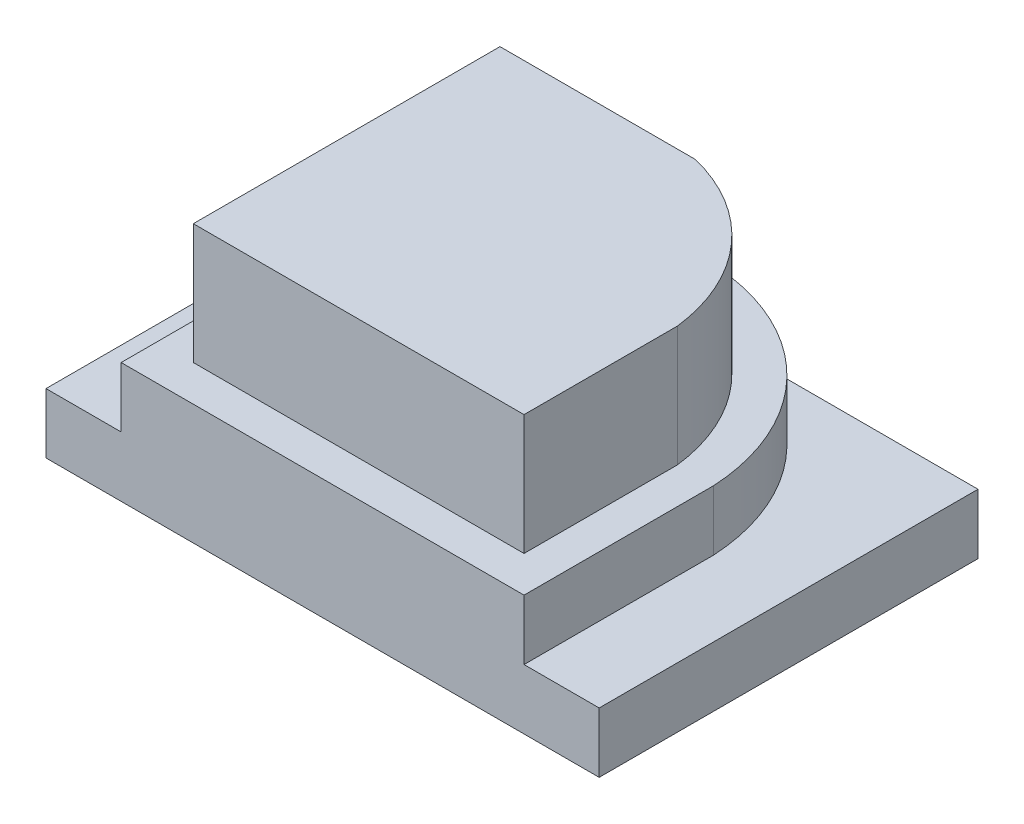
ISO-10303-21;
HEADER;
FILE_DESCRIPTION(('STEP AP214'),'2;1');
FILE_NAME('part.step','',(''),(''),'','','');
FILE_SCHEMA(('AUTOMOTIVE_DESIGN { 1 0 10303 214 1 1 1 1 }'));
ENDSEC;
DATA;
#1=APPLICATION_CONTEXT('core data for automotive mechanical design processes');
#2=APPLICATION_PROTOCOL_DEFINITION('international standard','automotive_design',2000,#1);
#3=PRODUCT_CONTEXT('',#1,'mechanical');
#4=PRODUCT('Part','Part','',(#3));
#5=PRODUCT_RELATED_PRODUCT_CATEGORY('part','',(#4));
#6=PRODUCT_DEFINITION_FORMATION('','',#4);
#7=PRODUCT_DEFINITION_CONTEXT('part definition',#1,'design');
#8=PRODUCT_DEFINITION('design','',#6,#7);
#9=PRODUCT_DEFINITION_SHAPE('','',#8);
#10=(LENGTH_UNIT() NAMED_UNIT(*) SI_UNIT(.MILLI.,.METRE.));
#11=(NAMED_UNIT(*) PLANE_ANGLE_UNIT() SI_UNIT($,.RADIAN.));
#12=(NAMED_UNIT(*) SI_UNIT($,.STERADIAN.) SOLID_ANGLE_UNIT());
#13=UNCERTAINTY_MEASURE_WITH_UNIT(LENGTH_MEASURE(1.E-05),#10,'distance_accuracy_value','');
#14=(GEOMETRIC_REPRESENTATION_CONTEXT(3) GLOBAL_UNCERTAINTY_ASSIGNED_CONTEXT((#13)) GLOBAL_UNIT_ASSIGNED_CONTEXT((#10,
#11,#12)) REPRESENTATION_CONTEXT('',''));
#15=CARTESIAN_POINT('',(0.,0.,0.));
#16=DIRECTION('',(0.,0.,1.));
#17=DIRECTION('',(1.,0.,0.));
#18=AXIS2_PLACEMENT_3D('',#15,#16,#17);
#19=CARTESIAN_POINT('',(-3.21955742457103,2.,-2.44744933126085));
#20=DIRECTION('',(0.,-1.,0.));
#21=DIRECTION('',(0.,0.,-1.));
#22=AXIS2_PLACEMENT_3D('',#19,#20,#21);
#23=CYLINDRICAL_SURFACE('',#22,2.99041189);
#24=CARTESIAN_POINT('',(-3.21955742457103,0.,-2.44744933126085));
#25=DIRECTION('',(0.,1.,0.));
#26=DIRECTION('',(0.,0.,1.));
#27=AXIS2_PLACEMENT_3D('',#24,#25,#26);
#28=CIRCLE('',#27,2.99041189);
#29=CARTESIAN_POINT('',(-2.5,0.,-5.35));
#30=VERTEX_POINT('',#29);
#31=CARTESIAN_POINT('',(-0.25,0.,-2.8));
#32=VERTEX_POINT('',#31);
#33=EDGE_CURVE('E117',#30,#32,#28,.F.);
#34=ORIENTED_EDGE('',*,*,#33,.F.);
#35=DIRECTION('',(0.,-1.,0.));
#36=VECTOR('',#35,1.);
#37=CARTESIAN_POINT('',(-2.5,2.,-5.35));
#38=LINE('',#37,#36);
#39=CARTESIAN_POINT('',(-2.5,2.,-5.35));
#40=VERTEX_POINT('',#39);
#41=EDGE_CURVE('E11',#40,#30,#38,.T.);
#42=ORIENTED_EDGE('',*,*,#41,.F.);
#43=CARTESIAN_POINT('',(-3.21955742457103,2.,-2.44744933126085));
#44=DIRECTION('',(0.,1.,0.));
#45=DIRECTION('',(0.,0.,1.));
#46=AXIS2_PLACEMENT_3D('',#43,#44,#45);
#47=CIRCLE('',#46,2.99041189);
#48=CARTESIAN_POINT('',(-0.25,2.,-2.8));
#49=VERTEX_POINT('',#48);
#50=EDGE_CURVE('E133',#40,#49,#47,.F.);
#51=ORIENTED_EDGE('',*,*,#50,.T.);
#52=DIRECTION('',(0.,-1.,0.));
#53=VECTOR('',#52,1.);
#54=CARTESIAN_POINT('',(-0.25,2.,-2.8));
#55=LINE('',#54,#53);
#56=EDGE_CURVE('E81',#49,#32,#55,.T.);
#57=ORIENTED_EDGE('',*,*,#56,.T.);
#58=EDGE_LOOP('',(#34,#42,#51,#57));
#59=FACE_BOUND('',#58,.T.);
#60=ADVANCED_FACE('F39',(#59),#23,.T.);
#61=CARTESIAN_POINT('',(0.,2.,-5.35));
#62=DIRECTION('',(0.,0.,-1.));
#63=DIRECTION('',(-1.,0.,0.));
#64=AXIS2_PLACEMENT_3D('',#61,#62,#63);
#65=PLANE('',#64);
#66=DIRECTION('',(1.,0.,0.));
#67=VECTOR('',#66,1.);
#68=CARTESIAN_POINT('',(0.,0.,-5.35));
#69=LINE('',#68,#67);
#70=CARTESIAN_POINT('',(-5.75,0.,-5.35));
#71=VERTEX_POINT('',#70);
#72=EDGE_CURVE('E121',#71,#30,#69,.T.);
#73=ORIENTED_EDGE('',*,*,#72,.F.);
#74=DIRECTION('',(0.,-1.,0.));
#75=VECTOR('',#74,1.);
#76=CARTESIAN_POINT('',(-5.75,2.,-5.35));
#77=LINE('',#76,#75);
#78=CARTESIAN_POINT('',(-5.75,2.,-5.35));
#79=VERTEX_POINT('',#78);
#80=EDGE_CURVE('E48',#79,#71,#77,.T.);
#81=ORIENTED_EDGE('',*,*,#80,.F.);
#82=DIRECTION('',(1.,0.,0.));
#83=VECTOR('',#82,1.);
#84=CARTESIAN_POINT('',(0.,2.,-5.35));
#85=LINE('',#84,#83);
#86=EDGE_CURVE('E99',#79,#40,#85,.T.);
#87=ORIENTED_EDGE('',*,*,#86,.T.);
#88=ORIENTED_EDGE('',*,*,#41,.T.);
#89=EDGE_LOOP('',(#73,#81,#87,#88));
#90=FACE_BOUND('',#89,.T.);
#91=ADVANCED_FACE('F140',(#90),#65,.T.);
#92=CARTESIAN_POINT('',(-5.75,2.,0.));
#93=DIRECTION('',(1.,0.,0.));
#94=DIRECTION('',(0.,0.,-1.));
#95=AXIS2_PLACEMENT_3D('',#92,#93,#94);
#96=PLANE('',#95);
#97=DIRECTION('',(0.,0.,1.));
#98=VECTOR('',#97,1.);
#99=CARTESIAN_POINT('',(-5.75,0.,0.));
#100=LINE('',#99,#98);
#101=CARTESIAN_POINT('',(-5.75,0.,-0.249999999999999));
#102=VERTEX_POINT('',#101);
#103=EDGE_CURVE('E106',#71,#102,#100,.T.);
#104=ORIENTED_EDGE('',*,*,#103,.T.);
#105=DIRECTION('',(0.,-1.,0.));
#106=VECTOR('',#105,1.);
#107=CARTESIAN_POINT('',(-5.75,2.,-0.249999999999999));
#108=LINE('',#107,#106);
#109=CARTESIAN_POINT('',(-5.75,2.,-0.249999999999999));
#110=VERTEX_POINT('',#109);
#111=EDGE_CURVE('E103',#110,#102,#108,.T.);
#112=ORIENTED_EDGE('',*,*,#111,.F.);
#113=DIRECTION('',(0.,0.,1.));
#114=VECTOR('',#113,1.);
#115=CARTESIAN_POINT('',(-5.75,2.,0.));
#116=LINE('',#115,#114);
#117=EDGE_CURVE('E93',#79,#110,#116,.T.);
#118=ORIENTED_EDGE('',*,*,#117,.F.);
#119=ORIENTED_EDGE('',*,*,#80,.T.);
#120=EDGE_LOOP('',(#104,#112,#118,#119));
#121=FACE_BOUND('',#120,.T.);
#122=ADVANCED_FACE('F104',(#121),#96,.F.);
#123=CARTESIAN_POINT('',(0.,2.,-0.249999999999999));
#124=DIRECTION('',(0.,0.,-1.));
#125=DIRECTION('',(-1.,0.,0.));
#126=AXIS2_PLACEMENT_3D('',#123,#124,#125);
#127=PLANE('',#126);
#128=DIRECTION('',(1.,0.,0.));
#129=VECTOR('',#128,1.);
#130=CARTESIAN_POINT('',(0.,0.,-0.249999999999999));
#131=LINE('',#130,#129);
#132=CARTESIAN_POINT('',(-0.25,0.,-0.249999999999999));
#133=VERTEX_POINT('',#132);
#134=EDGE_CURVE('E74',#102,#133,#131,.T.);
#135=ORIENTED_EDGE('',*,*,#134,.T.);
#136=DIRECTION('',(0.,-1.,0.));
#137=VECTOR('',#136,1.);
#138=CARTESIAN_POINT('',(-0.25,2.,-0.249999999999999));
#139=LINE('',#138,#137);
#140=CARTESIAN_POINT('',(-0.25,2.,-0.249999999999999));
#141=VERTEX_POINT('',#140);
#142=EDGE_CURVE('E108',#141,#133,#139,.T.);
#143=ORIENTED_EDGE('',*,*,#142,.F.);
#144=DIRECTION('',(1.,0.,0.));
#145=VECTOR('',#144,1.);
#146=CARTESIAN_POINT('',(0.,2.,-0.249999999999999));
#147=LINE('',#146,#145);
#148=EDGE_CURVE('E97',#110,#141,#147,.T.);
#149=ORIENTED_EDGE('',*,*,#148,.F.);
#150=ORIENTED_EDGE('',*,*,#111,.T.);
#151=EDGE_LOOP('',(#135,#143,#149,#150));
#152=FACE_BOUND('',#151,.T.);
#153=ADVANCED_FACE('F110',(#152),#127,.F.);
#154=CARTESIAN_POINT('',(-0.25,2.,0.));
#155=DIRECTION('',(-1.,0.,0.));
#156=DIRECTION('',(0.,0.,1.));
#157=AXIS2_PLACEMENT_3D('',#154,#155,#156);
#158=PLANE('',#157);
#159=DIRECTION('',(0.,0.,-1.));
#160=VECTOR('',#159,1.);
#161=CARTESIAN_POINT('',(-0.25,0.,0.));
#162=LINE('',#161,#160);
#163=EDGE_CURVE('E130',#133,#32,#162,.T.);
#164=ORIENTED_EDGE('',*,*,#163,.T.);
#165=ORIENTED_EDGE('',*,*,#56,.F.);
#166=DIRECTION('',(0.,0.,-1.));
#167=VECTOR('',#166,1.);
#168=CARTESIAN_POINT('',(-0.25,2.,0.));
#169=LINE('',#168,#167);
#170=EDGE_CURVE('E56',#141,#49,#169,.T.);
#171=ORIENTED_EDGE('',*,*,#170,.F.);
#172=ORIENTED_EDGE('',*,*,#142,.T.);
#173=EDGE_LOOP('',(#164,#165,#171,#172));
#174=FACE_BOUND('',#173,.T.);
#175=ADVANCED_FACE('F145',(#174),#158,.F.);
#176=CARTESIAN_POINT('',(0.,2.,0.));
#177=DIRECTION('',(0.,1.,0.));
#178=DIRECTION('',(0.,0.,1.));
#179=AXIS2_PLACEMENT_3D('',#176,#177,#178);
#180=PLANE('',#179);
#181=ORIENTED_EDGE('',*,*,#50,.F.);
#182=ORIENTED_EDGE('',*,*,#86,.F.);
#183=ORIENTED_EDGE('',*,*,#117,.T.);
#184=ORIENTED_EDGE('',*,*,#148,.T.);
#185=ORIENTED_EDGE('',*,*,#170,.T.);
#186=EDGE_LOOP('',(#181,#182,#183,#184,#185));
#187=FACE_BOUND('',#186,.T.);
#188=ADVANCED_FACE('F95',(#187),#180,.T.);
#189=CARTESIAN_POINT('',(-3.00990920916928,0.,-2.62436785837065));
#190=DIRECTION('',(0.,-1.,0.));
#191=DIRECTION('',(0.,0.,-1.));
#192=AXIS2_PLACEMENT_3D('',#189,#190,#191);
#193=PLANE('',#192);
#194=DIRECTION('',(0.,0.,-1.));
#195=VECTOR('',#194,1.);
#196=CARTESIAN_POINT('',(-6.35,0.,0.35));
#197=LINE('',#196,#195);
#198=CARTESIAN_POINT('',(-6.35,0.,0.35));
#199=VERTEX_POINT('',#198);
#200=CARTESIAN_POINT('',(-6.35,0.,-5.95));
#201=VERTEX_POINT('',#200);
#202=EDGE_CURVE('E187',#199,#201,#197,.T.);
#203=ORIENTED_EDGE('',*,*,#202,.F.);
#204=DIRECTION('',(-1.,0.,0.));
#205=VECTOR('',#204,1.);
#206=CARTESIAN_POINT('',(-6.35,0.,0.35));
#207=LINE('',#206,#205);
#208=CARTESIAN_POINT('',(0.35,0.,0.35));
#209=VERTEX_POINT('',#208);
#210=EDGE_CURVE('E170',#209,#199,#207,.T.);
#211=ORIENTED_EDGE('',*,*,#210,.F.);
#212=DIRECTION('',(0.,0.,1.));
#213=VECTOR('',#212,1.);
#214=CARTESIAN_POINT('',(0.35,0.,0.35));
#215=LINE('',#214,#213);
#216=CARTESIAN_POINT('',(0.35,0.,-2.8));
#217=VERTEX_POINT('',#216);
#218=EDGE_CURVE('E175',#217,#209,#215,.T.);
#219=ORIENTED_EDGE('',*,*,#218,.F.);
#220=CARTESIAN_POINT('',(-3.00990920916928,0.,-2.62436785837065));
#221=DIRECTION('',(0.,-1.,0.));
#222=DIRECTION('',(0.,0.,-1.));
#223=AXIS2_PLACEMENT_3D('',#220,#221,#222);
#224=CIRCLE('',#223,3.36449647689425);
#225=CARTESIAN_POINT('',(-2.5,0.,-5.95));
#226=VERTEX_POINT('',#225);
#227=EDGE_CURVE('E179',#226,#217,#224,.T.);
#228=ORIENTED_EDGE('',*,*,#227,.F.);
#229=DIRECTION('',(1.,0.,0.));
#230=VECTOR('',#229,1.);
#231=CARTESIAN_POINT('',(-6.35,0.,-5.95));
#232=LINE('',#231,#230);
#233=EDGE_CURVE('E183',#201,#226,#232,.T.);
#234=ORIENTED_EDGE('',*,*,#233,.F.);
#235=EDGE_LOOP('',(#203,#211,#219,#228,#234));
#236=FACE_BOUND('',#235,.T.);
#237=ORIENTED_EDGE('',*,*,#72,.T.);
#238=ORIENTED_EDGE('',*,*,#33,.T.);
#239=ORIENTED_EDGE('',*,*,#163,.F.);
#240=ORIENTED_EDGE('',*,*,#134,.F.);
#241=ORIENTED_EDGE('',*,*,#103,.F.);
#242=EDGE_LOOP('',(#237,#238,#239,#240,#241));
#243=FACE_BOUND('',#242,.T.);
#244=ADVANCED_FACE('F142',(#236,#243),#193,.F.);
#245=CARTESIAN_POINT('',(-6.35,-1.,0.35));
#246=DIRECTION('',(1.,0.,0.));
#247=DIRECTION('',(0.,0.,-1.));
#248=AXIS2_PLACEMENT_3D('',#245,#246,#247);
#249=PLANE('',#248);
#250=ORIENTED_EDGE('',*,*,#202,.T.);
#251=DIRECTION('',(0.,1.,0.));
#252=VECTOR('',#251,1.);
#253=CARTESIAN_POINT('',(-6.35,-1.,-5.95));
#254=LINE('',#253,#252);
#255=CARTESIAN_POINT('',(-6.35,-1.,-5.95));
#256=VERTEX_POINT('',#255);
#257=EDGE_CURVE('E122',#256,#201,#254,.T.);
#258=ORIENTED_EDGE('',*,*,#257,.F.);
#259=DIRECTION('',(0.,0.,-1.));
#260=VECTOR('',#259,1.);
#261=CARTESIAN_POINT('',(-6.35,-1.,0.35));
#262=LINE('',#261,#260);
#263=CARTESIAN_POINT('',(-6.35,-1.,0.35));
#264=VERTEX_POINT('',#263);
#265=EDGE_CURVE('E174',#264,#256,#262,.T.);
#266=ORIENTED_EDGE('',*,*,#265,.F.);
#267=DIRECTION('',(0.,1.,0.));
#268=VECTOR('',#267,1.);
#269=CARTESIAN_POINT('',(-6.35,-1.,0.35));
#270=LINE('',#269,#268);
#271=EDGE_CURVE('E165',#264,#199,#270,.T.);
#272=ORIENTED_EDGE('',*,*,#271,.T.);
#273=EDGE_LOOP('',(#250,#258,#266,#272));
#274=FACE_BOUND('',#273,.T.);
#275=ADVANCED_FACE('F314',(#274),#249,.F.);
#276=CARTESIAN_POINT('',(-6.35,-1.,-5.95));
#277=DIRECTION('',(0.,0.,1.));
#278=DIRECTION('',(1.,0.,0.));
#279=AXIS2_PLACEMENT_3D('',#276,#277,#278);
#280=PLANE('',#279);
#281=ORIENTED_EDGE('',*,*,#233,.T.);
#282=DIRECTION('',(0.,1.,0.));
#283=VECTOR('',#282,1.);
#284=CARTESIAN_POINT('',(-2.5,-1.,-5.95));
#285=LINE('',#284,#283);
#286=CARTESIAN_POINT('',(-2.5,-1.,-5.95));
#287=VERTEX_POINT('',#286);
#288=EDGE_CURVE('E153',#287,#226,#285,.T.);
#289=ORIENTED_EDGE('',*,*,#288,.F.);
#290=DIRECTION('',(1.,0.,0.));
#291=VECTOR('',#290,1.);
#292=CARTESIAN_POINT('',(-7.6,-1.,-5.95));
#293=LINE('',#292,#291);
#294=CARTESIAN_POINT('',(1.6,-1.,-5.95));
#295=VERTEX_POINT('',#294);
#296=EDGE_CURVE('E232',#287,#295,#293,.T.);
#297=ORIENTED_EDGE('',*,*,#296,.T.);
#298=DIRECTION('',(0.,1.,0.));
#299=VECTOR('',#298,1.);
#300=CARTESIAN_POINT('',(1.6,-2.,-5.95));
#301=LINE('',#300,#299);
#302=CARTESIAN_POINT('',(1.6,-2.,-5.95));
#303=VERTEX_POINT('',#302);
#304=EDGE_CURVE('E205',#303,#295,#301,.T.);
#305=ORIENTED_EDGE('',*,*,#304,.F.);
#306=DIRECTION('',(1.,0.,0.));
#307=VECTOR('',#306,1.);
#308=CARTESIAN_POINT('',(-7.6,-2.,-5.95));
#309=LINE('',#308,#307);
#310=CARTESIAN_POINT('',(-7.6,-2.,-5.95));
#311=VERTEX_POINT('',#310);
#312=EDGE_CURVE('E244',#311,#303,#309,.T.);
#313=ORIENTED_EDGE('',*,*,#312,.F.);
#314=DIRECTION('',(0.,1.,0.));
#315=VECTOR('',#314,1.);
#316=CARTESIAN_POINT('',(-7.6,-2.,-5.95));
#317=LINE('',#316,#315);
#318=CARTESIAN_POINT('',(-7.6,-1.,-5.95));
#319=VERTEX_POINT('',#318);
#320=EDGE_CURVE('E191',#311,#319,#317,.T.);
#321=ORIENTED_EDGE('',*,*,#320,.T.);
#322=EDGE_CURVE('E228',#319,#256,#293,.T.);
#323=ORIENTED_EDGE('',*,*,#322,.T.);
#324=ORIENTED_EDGE('',*,*,#257,.T.);
#325=EDGE_LOOP('',(#281,#289,#297,#305,#313,#321,#323,#324));
#326=FACE_BOUND('',#325,.T.);
#327=ADVANCED_FACE('F268',(#326),#280,.F.);
#328=CARTESIAN_POINT('',(-3.00990920916928,-1.,-2.62436785837065));
#329=DIRECTION('',(0.,1.,0.));
#330=DIRECTION('',(0.,0.,1.));
#331=AXIS2_PLACEMENT_3D('',#328,#329,#330);
#332=CYLINDRICAL_SURFACE('',#331,3.36449647689425);
#333=ORIENTED_EDGE('',*,*,#227,.T.);
#334=DIRECTION('',(0.,1.,0.));
#335=VECTOR('',#334,1.);
#336=CARTESIAN_POINT('',(0.35,-1.,-2.8));
#337=LINE('',#336,#335);
#338=CARTESIAN_POINT('',(0.35,-1.,-2.8));
#339=VERTEX_POINT('',#338);
#340=EDGE_CURVE('E157',#339,#217,#337,.T.);
#341=ORIENTED_EDGE('',*,*,#340,.F.);
#342=CARTESIAN_POINT('',(-3.00990920916928,-1.,-2.62436785837065));
#343=DIRECTION('',(0.,-1.,0.));
#344=DIRECTION('',(0.,0.,-1.));
#345=AXIS2_PLACEMENT_3D('',#342,#343,#344);
#346=CIRCLE('',#345,3.36449647689425);
#347=EDGE_CURVE('E195',#287,#339,#346,.T.);
#348=ORIENTED_EDGE('',*,*,#347,.F.);
#349=ORIENTED_EDGE('',*,*,#288,.T.);
#350=EDGE_LOOP('',(#333,#341,#348,#349));
#351=FACE_BOUND('',#350,.T.);
#352=ADVANCED_FACE('F336',(#351),#332,.T.);
#353=CARTESIAN_POINT('',(0.35,-1.,0.35));
#354=DIRECTION('',(-1.,0.,0.));
#355=DIRECTION('',(0.,0.,1.));
#356=AXIS2_PLACEMENT_3D('',#353,#354,#355);
#357=PLANE('',#356);
#358=ORIENTED_EDGE('',*,*,#218,.T.);
#359=DIRECTION('',(0.,1.,0.));
#360=VECTOR('',#359,1.);
#361=CARTESIAN_POINT('',(0.35,-1.,0.35));
#362=LINE('',#361,#360);
#363=CARTESIAN_POINT('',(0.35,-1.,0.35));
#364=VERTEX_POINT('',#363);
#365=EDGE_CURVE('E161',#364,#209,#362,.T.);
#366=ORIENTED_EDGE('',*,*,#365,.F.);
#367=DIRECTION('',(0.,0.,1.));
#368=VECTOR('',#367,1.);
#369=CARTESIAN_POINT('',(0.35,-1.,0.35));
#370=LINE('',#369,#368);
#371=EDGE_CURVE('E169',#339,#364,#370,.T.);
#372=ORIENTED_EDGE('',*,*,#371,.F.);
#373=ORIENTED_EDGE('',*,*,#340,.T.);
#374=EDGE_LOOP('',(#358,#366,#372,#373));
#375=FACE_BOUND('',#374,.T.);
#376=ADVANCED_FACE('F334',(#375),#357,.F.);
#377=CARTESIAN_POINT('',(-6.35,-1.,0.35));
#378=DIRECTION('',(0.,0.,-1.));
#379=DIRECTION('',(-1.,0.,0.));
#380=AXIS2_PLACEMENT_3D('',#377,#378,#379);
#381=PLANE('',#380);
#382=ORIENTED_EDGE('',*,*,#210,.T.);
#383=ORIENTED_EDGE('',*,*,#271,.F.);
#384=DIRECTION('',(-1.,0.,0.));
#385=VECTOR('',#384,1.);
#386=CARTESIAN_POINT('',(-7.6,-1.,0.35));
#387=LINE('',#386,#385);
#388=CARTESIAN_POINT('',(-7.6,-1.,0.35));
#389=VERTEX_POINT('',#388);
#390=EDGE_CURVE('E223',#264,#389,#387,.T.);
#391=ORIENTED_EDGE('',*,*,#390,.T.);
#392=DIRECTION('',(0.,1.,0.));
#393=VECTOR('',#392,1.);
#394=CARTESIAN_POINT('',(-7.6,-2.,0.35));
#395=LINE('',#394,#393);
#396=CARTESIAN_POINT('',(-7.6,-2.,0.35));
#397=VERTEX_POINT('',#396);
#398=EDGE_CURVE('E213',#397,#389,#395,.T.);
#399=ORIENTED_EDGE('',*,*,#398,.F.);
#400=DIRECTION('',(-1.,0.,0.));
#401=VECTOR('',#400,1.);
#402=CARTESIAN_POINT('',(-7.6,-2.,0.35));
#403=LINE('',#402,#401);
#404=CARTESIAN_POINT('',(1.6,-2.,0.35));
#405=VERTEX_POINT('',#404);
#406=EDGE_CURVE('E217',#405,#397,#403,.T.);
#407=ORIENTED_EDGE('',*,*,#406,.F.);
#408=DIRECTION('',(0.,1.,0.));
#409=VECTOR('',#408,1.);
#410=CARTESIAN_POINT('',(1.6,-2.,0.35));
#411=LINE('',#410,#409);
#412=CARTESIAN_POINT('',(1.6,-1.,0.35));
#413=VERTEX_POINT('',#412);
#414=EDGE_CURVE('E209',#405,#413,#411,.T.);
#415=ORIENTED_EDGE('',*,*,#414,.T.);
#416=EDGE_CURVE('E218',#413,#364,#387,.T.);
#417=ORIENTED_EDGE('',*,*,#416,.T.);
#418=ORIENTED_EDGE('',*,*,#365,.T.);
#419=EDGE_LOOP('',(#382,#383,#391,#399,#407,#415,#417,#418));
#420=FACE_BOUND('',#419,.T.);
#421=ADVANCED_FACE('F308',(#420),#381,.F.);
#422=CARTESIAN_POINT('',(0.,-1.,0.));
#423=DIRECTION('',(0.,-1.,0.));
#424=DIRECTION('',(0.,0.,-1.));
#425=AXIS2_PLACEMENT_3D('',#422,#423,#424);
#426=PLANE('',#425);
#427=ORIENTED_EDGE('',*,*,#390,.F.);
#428=ORIENTED_EDGE('',*,*,#265,.T.);
#429=ORIENTED_EDGE('',*,*,#322,.F.);
#430=DIRECTION('',(0.,0.,-1.));
#431=VECTOR('',#430,1.);
#432=CARTESIAN_POINT('',(-7.6,-1.,0.35));
#433=LINE('',#432,#431);
#434=EDGE_CURVE('E233',#389,#319,#433,.T.);
#435=ORIENTED_EDGE('',*,*,#434,.F.);
#436=EDGE_LOOP('',(#427,#428,#429,#435));
#437=FACE_BOUND('',#436,.T.);
#438=ADVANCED_FACE('F317',(#437),#426,.F.);
#439=ORIENTED_EDGE('',*,*,#296,.F.);
#440=ORIENTED_EDGE('',*,*,#347,.T.);
#441=ORIENTED_EDGE('',*,*,#371,.T.);
#442=ORIENTED_EDGE('',*,*,#416,.F.);
#443=DIRECTION('',(0.,0.,1.));
#444=VECTOR('',#443,1.);
#445=CARTESIAN_POINT('',(1.6,-1.,0.35));
#446=LINE('',#445,#444);
#447=EDGE_CURVE('E224',#295,#413,#446,.T.);
#448=ORIENTED_EDGE('',*,*,#447,.F.);
#449=EDGE_LOOP('',(#439,#440,#441,#442,#448));
#450=FACE_BOUND('',#449,.T.);
#451=ADVANCED_FACE('F329',(#450),#426,.F.);
#452=CARTESIAN_POINT('',(-7.6,-2.,0.35));
#453=DIRECTION('',(1.,0.,0.));
#454=DIRECTION('',(0.,0.,-1.));
#455=AXIS2_PLACEMENT_3D('',#452,#453,#454);
#456=PLANE('',#455);
#457=ORIENTED_EDGE('',*,*,#434,.T.);
#458=ORIENTED_EDGE('',*,*,#320,.F.);
#459=DIRECTION('',(0.,0.,-1.));
#460=VECTOR('',#459,1.);
#461=CARTESIAN_POINT('',(-7.6,-2.,0.35));
#462=LINE('',#461,#460);
#463=EDGE_CURVE('E222',#397,#311,#462,.T.);
#464=ORIENTED_EDGE('',*,*,#463,.F.);
#465=ORIENTED_EDGE('',*,*,#398,.T.);
#466=EDGE_LOOP('',(#457,#458,#464,#465));
#467=FACE_BOUND('',#466,.T.);
#468=ADVANCED_FACE('F264',(#467),#456,.F.);
#469=CARTESIAN_POINT('',(1.6,-2.,0.35));
#470=DIRECTION('',(-1.,0.,0.));
#471=DIRECTION('',(0.,0.,1.));
#472=AXIS2_PLACEMENT_3D('',#469,#470,#471);
#473=PLANE('',#472);
#474=ORIENTED_EDGE('',*,*,#447,.T.);
#475=ORIENTED_EDGE('',*,*,#414,.F.);
#476=DIRECTION('',(0.,0.,1.));
#477=VECTOR('',#476,1.);
#478=CARTESIAN_POINT('',(1.6,-2.,0.35));
#479=LINE('',#478,#477);
#480=EDGE_CURVE('E240',#303,#405,#479,.T.);
#481=ORIENTED_EDGE('',*,*,#480,.F.);
#482=ORIENTED_EDGE('',*,*,#304,.T.);
#483=EDGE_LOOP('',(#474,#475,#481,#482));
#484=FACE_BOUND('',#483,.T.);
#485=ADVANCED_FACE('F326',(#484),#473,.F.);
#486=CARTESIAN_POINT('',(0.,-2.,0.));
#487=DIRECTION('',(0.,-1.,0.));
#488=DIRECTION('',(0.,0.,-1.));
#489=AXIS2_PLACEMENT_3D('',#486,#487,#488);
#490=PLANE('',#489);
#491=ORIENTED_EDGE('',*,*,#463,.T.);
#492=ORIENTED_EDGE('',*,*,#312,.T.);
#493=ORIENTED_EDGE('',*,*,#480,.T.);
#494=ORIENTED_EDGE('',*,*,#406,.T.);
#495=EDGE_LOOP('',(#491,#492,#493,#494));
#496=FACE_BOUND('',#495,.T.);
#497=ADVANCED_FACE('F254',(#496),#490,.T.);
#498=CLOSED_SHELL('',(#60,#91,#122,#153,#175,#188,#244,#275,#327,#352,#376,#421,#438,#451,#468,
#485,#497));
#499=MANIFOLD_SOLID_BREP('B2',#498);
#500=ADVANCED_BREP_SHAPE_REPRESENTATION('',(#18,#499),#14);
#501=SHAPE_DEFINITION_REPRESENTATION(#9,#500);
ENDSEC;
END-ISO-10303-21;
